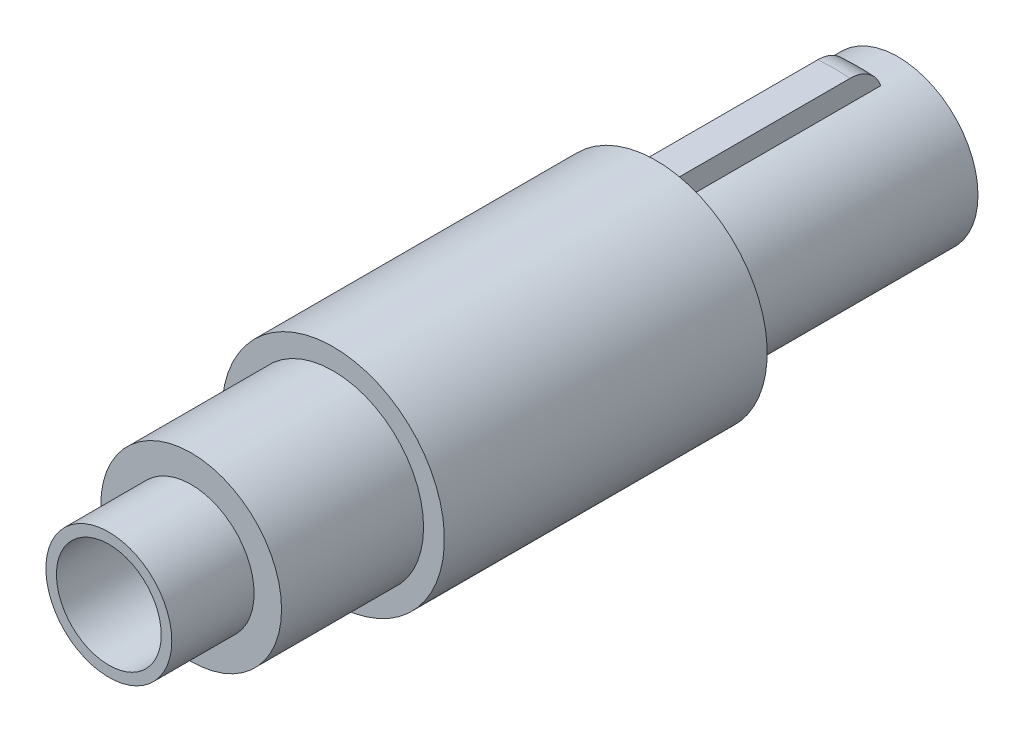
ISO-10303-21;
HEADER;
FILE_DESCRIPTION(('STEP AP214'),'2;1');
FILE_NAME('part.step','',(''),(''),'','','');
FILE_SCHEMA(('AUTOMOTIVE_DESIGN { 1 0 10303 214 1 1 1 1 }'));
ENDSEC;
DATA;
#1=APPLICATION_CONTEXT('core data for automotive mechanical design processes');
#2=APPLICATION_PROTOCOL_DEFINITION('international standard','automotive_design',2000,#1);
#3=PRODUCT_CONTEXT('',#1,'mechanical');
#4=PRODUCT('Part','Part','',(#3));
#5=PRODUCT_RELATED_PRODUCT_CATEGORY('part','',(#4));
#6=PRODUCT_DEFINITION_FORMATION('','',#4);
#7=PRODUCT_DEFINITION_CONTEXT('part definition',#1,'design');
#8=PRODUCT_DEFINITION('design','',#6,#7);
#9=PRODUCT_DEFINITION_SHAPE('','',#8);
#10=(LENGTH_UNIT() NAMED_UNIT(*) SI_UNIT(.MILLI.,.METRE.));
#11=(NAMED_UNIT(*) PLANE_ANGLE_UNIT() SI_UNIT($,.RADIAN.));
#12=(NAMED_UNIT(*) SI_UNIT($,.STERADIAN.) SOLID_ANGLE_UNIT());
#13=UNCERTAINTY_MEASURE_WITH_UNIT(LENGTH_MEASURE(1.E-05),#10,'distance_accuracy_value','');
#14=(GEOMETRIC_REPRESENTATION_CONTEXT(3) GLOBAL_UNCERTAINTY_ASSIGNED_CONTEXT((#13)) GLOBAL_UNIT_ASSIGNED_CONTEXT((#10,
#11,#12)) REPRESENTATION_CONTEXT('',''));
#15=CARTESIAN_POINT('',(0.,0.,0.));
#16=DIRECTION('',(0.,0.,1.));
#17=DIRECTION('',(1.,0.,0.));
#18=AXIS2_PLACEMENT_3D('',#15,#16,#17);
#19=CARTESIAN_POINT('',(0.,0.,28.8));
#20=DIRECTION('',(0.,0.,1.));
#21=DIRECTION('',(1.,0.,0.));
#22=AXIS2_PLACEMENT_3D('',#19,#20,#21);
#23=PLANE('',#22);
#24=CARTESIAN_POINT('',(0.,0.,28.8));
#25=DIRECTION('',(0.,0.,1.));
#26=DIRECTION('',(1.,0.,0.));
#27=AXIS2_PLACEMENT_3D('',#24,#25,#26);
#28=CIRCLE('',#27,5.6);
#29=CARTESIAN_POINT('',(5.6,0.,28.8));
#30=VERTEX_POINT('',#29);
#31=EDGE_CURVE('E185',#30,#30,#28,.T.);
#32=ORIENTED_EDGE('',*,*,#31,.T.);
#33=EDGE_LOOP('',(#32));
#34=FACE_BOUND('',#33,.T.);
#35=CARTESIAN_POINT('',(0.,0.,28.8));
#36=DIRECTION('',(0.,0.,1.));
#37=DIRECTION('',(1.,0.,0.));
#38=AXIS2_PLACEMENT_3D('',#35,#36,#37);
#39=CIRCLE('',#38,3.9);
#40=CARTESIAN_POINT('',(3.9,0.,28.8));
#41=VERTEX_POINT('',#40);
#42=EDGE_CURVE('E100',#41,#41,#39,.F.);
#43=ORIENTED_EDGE('',*,*,#42,.T.);
#44=EDGE_LOOP('',(#43));
#45=FACE_BOUND('',#44,.T.);
#46=ADVANCED_FACE('F32',(#34,#45),#23,.T.);
#47=CARTESIAN_POINT('',(0.,0.,20.));
#48=DIRECTION('',(0.,0.,1.));
#49=DIRECTION('',(1.,0.,0.));
#50=AXIS2_PLACEMENT_3D('',#47,#48,#49);
#51=PLANE('',#50);
#52=CARTESIAN_POINT('',(0.,0.,20.));
#53=DIRECTION('',(0.,0.,1.));
#54=DIRECTION('',(1.,0.,0.));
#55=AXIS2_PLACEMENT_3D('',#52,#53,#54);
#56=CIRCLE('',#55,6.89);
#57=CARTESIAN_POINT('',(-6.89,0.,20.));
#58=VERTEX_POINT('',#57);
#59=EDGE_CURVE('E94',#58,#58,#56,.T.);
#60=ORIENTED_EDGE('',*,*,#59,.T.);
#61=EDGE_LOOP('',(#60));
#62=FACE_BOUND('',#61,.T.);
#63=CARTESIAN_POINT('',(0.,0.,20.));
#64=DIRECTION('',(0.,0.,1.));
#65=DIRECTION('',(1.,0.,0.));
#66=AXIS2_PLACEMENT_3D('',#63,#64,#65);
#67=CIRCLE('',#66,5.6);
#68=CARTESIAN_POINT('',(5.6,0.,20.));
#69=VERTEX_POINT('',#68);
#70=EDGE_CURVE('E183',#69,#69,#67,.F.);
#71=ORIENTED_EDGE('',*,*,#70,.T.);
#72=EDGE_LOOP('',(#71));
#73=FACE_BOUND('',#72,.T.);
#74=ADVANCED_FACE('F147',(#62,#73),#51,.T.);
#75=CARTESIAN_POINT('',(0.,0.,20.));
#76=DIRECTION('',(0.,0.,-1.));
#77=DIRECTION('',(-1.,0.,0.));
#78=AXIS2_PLACEMENT_3D('',#75,#76,#77);
#79=CYLINDRICAL_SURFACE('',#78,6.89);
#80=CARTESIAN_POINT('',(0.,0.,0.));
#81=DIRECTION('',(0.,0.,1.));
#82=DIRECTION('',(1.,0.,0.));
#83=AXIS2_PLACEMENT_3D('',#80,#81,#82);
#84=CIRCLE('',#83,6.89);
#85=CARTESIAN_POINT('',(-6.89,0.,0.));
#86=VERTEX_POINT('',#85);
#87=EDGE_CURVE('E97',#86,#86,#84,.T.);
#88=CARTESIAN_POINT('',(-6.89,0.,20.));
#89=CARTESIAN_POINT('',(-6.89,0.,19.7916666666667));
#90=CARTESIAN_POINT('',(-6.89,0.,19.5833333333333));
#91=CARTESIAN_POINT('',(-6.89,0.,19.1666666666667));
#92=CARTESIAN_POINT('',(-6.89,0.,18.9583333333333));
#93=CARTESIAN_POINT('',(-6.89,0.,18.5416666666667));
#94=CARTESIAN_POINT('',(-6.89,0.,18.3333333333333));
#95=CARTESIAN_POINT('',(-6.89,0.,17.9166666666667));
#96=CARTESIAN_POINT('',(-6.89,0.,17.7083333333333));
#97=CARTESIAN_POINT('',(-6.89,0.,17.2916666666667));
#98=CARTESIAN_POINT('',(-6.89,0.,17.0833333333333));
#99=CARTESIAN_POINT('',(-6.89,0.,16.6666666666667));
#100=CARTESIAN_POINT('',(-6.89,0.,16.4583333333333));
#101=CARTESIAN_POINT('',(-6.89,0.,16.0416666666667));
#102=CARTESIAN_POINT('',(-6.89,0.,15.8333333333333));
#103=CARTESIAN_POINT('',(-6.89,0.,15.4166666666667));
#104=CARTESIAN_POINT('',(-6.89,0.,15.2083333333333));
#105=CARTESIAN_POINT('',(-6.89,0.,14.7916666666667));
#106=CARTESIAN_POINT('',(-6.89,0.,14.5833333333333));
#107=CARTESIAN_POINT('',(-6.89,0.,14.1666666666667));
#108=CARTESIAN_POINT('',(-6.89,0.,13.9583333333333));
#109=CARTESIAN_POINT('',(-6.89,0.,13.5416666666667));
#110=CARTESIAN_POINT('',(-6.89,0.,13.3333333333333));
#111=CARTESIAN_POINT('',(-6.89,0.,12.9166666666667));
#112=CARTESIAN_POINT('',(-6.89,0.,12.7083333333333));
#113=CARTESIAN_POINT('',(-6.89,0.,12.2916666666667));
#114=CARTESIAN_POINT('',(-6.89,0.,12.0833333333333));
#115=CARTESIAN_POINT('',(-6.89,0.,11.6666666666667));
#116=CARTESIAN_POINT('',(-6.89,0.,11.4583333333333));
#117=CARTESIAN_POINT('',(-6.89,0.,11.0416666666667));
#118=CARTESIAN_POINT('',(-6.89,0.,10.8333333333333));
#119=CARTESIAN_POINT('',(-6.89,0.,10.4166666666667));
#120=CARTESIAN_POINT('',(-6.89,0.,10.2083333333333));
#121=CARTESIAN_POINT('',(-6.89,0.,9.79166666666667));
#122=CARTESIAN_POINT('',(-6.89,0.,9.58333333333333));
#123=CARTESIAN_POINT('',(-6.89,0.,9.16666666666667));
#124=CARTESIAN_POINT('',(-6.89,0.,8.95833333333333));
#125=CARTESIAN_POINT('',(-6.89,0.,8.54166666666667));
#126=CARTESIAN_POINT('',(-6.89,0.,8.33333333333333));
#127=CARTESIAN_POINT('',(-6.89,0.,7.91666666666667));
#128=CARTESIAN_POINT('',(-6.89,0.,7.70833333333333));
#129=CARTESIAN_POINT('',(-6.89,0.,7.29166666666667));
#130=CARTESIAN_POINT('',(-6.89,0.,7.08333333333333));
#131=CARTESIAN_POINT('',(-6.89,0.,6.66666666666667));
#132=CARTESIAN_POINT('',(-6.89,0.,6.45833333333333));
#133=CARTESIAN_POINT('',(-6.89,0.,6.04166666666667));
#134=CARTESIAN_POINT('',(-6.89,0.,5.83333333333333));
#135=CARTESIAN_POINT('',(-6.89,0.,5.41666666666667));
#136=CARTESIAN_POINT('',(-6.89,0.,5.20833333333333));
#137=CARTESIAN_POINT('',(-6.89,0.,4.79166666666667));
#138=CARTESIAN_POINT('',(-6.89,0.,4.58333333333334));
#139=CARTESIAN_POINT('',(-6.89,0.,4.16666666666667));
#140=CARTESIAN_POINT('',(-6.89,0.,3.95833333333334));
#141=CARTESIAN_POINT('',(-6.89,0.,3.54166666666667));
#142=CARTESIAN_POINT('',(-6.89,0.,3.33333333333334));
#143=CARTESIAN_POINT('',(-6.89,0.,2.91666666666667));
#144=CARTESIAN_POINT('',(-6.89,0.,2.70833333333334));
#145=CARTESIAN_POINT('',(-6.89,0.,2.29166666666667));
#146=CARTESIAN_POINT('',(-6.89,0.,2.08333333333334));
#147=CARTESIAN_POINT('',(-6.89,0.,1.66666666666667));
#148=CARTESIAN_POINT('',(-6.89,0.,1.45833333333333));
#149=CARTESIAN_POINT('',(-6.89,0.,1.04166666666667));
#150=CARTESIAN_POINT('',(-6.89,0.,0.833333333333334));
#151=CARTESIAN_POINT('',(-6.89,0.,0.416666666666667));
#152=CARTESIAN_POINT('',(-6.89,0.,0.208333333333334));
#153=CARTESIAN_POINT('',(-6.89,0.,0.));
#154=B_SPLINE_CURVE_WITH_KNOTS('',3,(#88,#89,#90,#91,#92,#93,#94,#95,#96,#97,#98,#99,#100,#101,
#102,#103,#104,#105,#106,#107,#108,#109,#110,#111,#112,#113,#114,#115,#116,#117,#118,#119,#120,
#121,#122,#123,#124,#125,#126,#127,#128,#129,#130,#131,#132,#133,#134,#135,#136,#137,#138,#139,
#140,#141,#142,#143,#144,#145,#146,#147,#148,#149,#150,#151,#152,#153),.UNSPECIFIED.,.F.,.F.,(4,
2,2,2,2,2,2,2,2,2,2,2,2,2,2,2,2,2,2,2,2,2,2,2,2,2,2,2,2,2,2,2,4),(0.,0.625000000000001,1.25,
1.875,2.5,3.125,3.75,4.375,5.,5.62500000000001,6.25000000000001,6.875,7.50000000000001,8.125,
8.75,9.37500000000001,10.,10.625,11.25,11.875,12.5,13.125,13.75,14.375,15.,15.625,16.25,16.875,
17.5,18.125,18.75,19.375,20.),.UNSPECIFIED.);
#155=EDGE_CURVE('BSEAM150',#58,#86,#154,.T.);
#156=ORIENTED_EDGE('',*,*,#59,.F.);
#157=ORIENTED_EDGE('',*,*,#87,.T.);
#158=ORIENTED_EDGE('',*,*,#155,.T.);
#159=ORIENTED_EDGE('',*,*,#155,.F.);
#160=EDGE_LOOP('',(#156,#158,#157,#159));
#161=FACE_BOUND('',#160,.T.);
#162=ADVANCED_FACE('F150',(#161),#79,.T.);
#163=CARTESIAN_POINT('',(0.,0.,0.));
#164=DIRECTION('',(0.,0.,1.));
#165=DIRECTION('',(1.,0.,0.));
#166=AXIS2_PLACEMENT_3D('',#163,#164,#165);
#167=PLANE('',#166);
#168=CARTESIAN_POINT('',(0.,0.,0.));
#169=DIRECTION('',(0.,0.,1.));
#170=DIRECTION('',(1.,0.,0.));
#171=AXIS2_PLACEMENT_3D('',#168,#169,#170);
#172=CIRCLE('',#171,4.95);
#173=CARTESIAN_POINT('',(-1.07177579889317,4.83257660434958,0.));
#174=VERTEX_POINT('',#173);
#175=CARTESIAN_POINT('',(0.928224201106829,4.86219084698242,0.));
#176=VERTEX_POINT('',#175);
#177=EDGE_CURVE('E90',#174,#176,#172,.T.);
#178=ORIENTED_EDGE('',*,*,#177,.T.);
#179=DIRECTION('',(0.,1.,0.));
#180=VECTOR('',#179,1.);
#181=CARTESIAN_POINT('',(0.928224201106829,4.20642129929581,0.));
#182=LINE('',#181,#180);
#183=CARTESIAN_POINT('',(0.928224201106829,6.20642129929581,0.));
#184=VERTEX_POINT('',#183);
#185=EDGE_CURVE('E202',#176,#184,#182,.T.);
#186=ORIENTED_EDGE('',*,*,#185,.T.);
#187=DIRECTION('',(-1.,0.,0.));
#188=VECTOR('',#187,1.);
#189=CARTESIAN_POINT('',(-1.07177579889317,6.20642129929581,0.));
#190=LINE('',#189,#188);
#191=CARTESIAN_POINT('',(-1.07177579889317,6.20642129929581,0.));
#192=VERTEX_POINT('',#191);
#193=EDGE_CURVE('E206',#184,#192,#190,.T.);
#194=ORIENTED_EDGE('',*,*,#193,.T.);
#195=DIRECTION('',(0.,-1.,0.));
#196=VECTOR('',#195,1.);
#197=CARTESIAN_POINT('',(-1.07177579889317,4.20642129929581,0.));
#198=LINE('',#197,#196);
#199=EDGE_CURVE('E204',#192,#174,#198,.T.);
#200=ORIENTED_EDGE('',*,*,#199,.T.);
#201=EDGE_LOOP('',(#178,#186,#194,#200));
#202=FACE_BOUND('',#201,.T.);
#203=ORIENTED_EDGE('',*,*,#87,.F.);
#204=EDGE_LOOP('',(#203));
#205=FACE_BOUND('',#204,.T.);
#206=ADVANCED_FACE('F145',(#202,#205),#167,.F.);
#207=CARTESIAN_POINT('',(0.,0.,-15.));
#208=DIRECTION('',(0.,0.,1.));
#209=DIRECTION('',(1.,0.,0.));
#210=AXIS2_PLACEMENT_3D('',#207,#208,#209);
#211=CYLINDRICAL_SURFACE('',#210,4.95);
#212=DIRECTION('',(0.,0.,1.));
#213=VECTOR('',#212,1.);
#214=CARTESIAN_POINT('',(0.928224201106829,4.86219084698242,-15.));
#215=LINE('',#214,#213);
#216=CARTESIAN_POINT('',(0.928224201106829,4.86219084698242,-13.));
#217=VERTEX_POINT('',#216);
#218=EDGE_CURVE('E91',#176,#217,#215,.F.);
#219=ORIENTED_EDGE('',*,*,#218,.F.);
#220=ORIENTED_EDGE('',*,*,#177,.F.);
#221=DIRECTION('',(0.,0.,1.));
#222=VECTOR('',#221,1.);
#223=CARTESIAN_POINT('',(-1.07177579889317,4.83257660434958,-15.));
#224=LINE('',#223,#222);
#225=CARTESIAN_POINT('',(-1.07177579889317,4.83257660434958,-13.));
#226=VERTEX_POINT('',#225);
#227=EDGE_CURVE('E80',#226,#174,#224,.T.);
#228=ORIENTED_EDGE('',*,*,#227,.F.);
#229=CARTESIAN_POINT('',(0.,0.,-13.));
#230=DIRECTION('',(0.,0.,-1.));
#231=DIRECTION('',(-1.,0.,0.));
#232=AXIS2_PLACEMENT_3D('',#229,#230,#231);
#233=CIRCLE('',#232,4.95);
#234=EDGE_CURVE('E88',#217,#226,#233,.F.);
#235=ORIENTED_EDGE('',*,*,#234,.F.);
#236=EDGE_LOOP('',(#219,#220,#228,#235));
#237=FACE_BOUND('',#236,.T.);
#238=CARTESIAN_POINT('',(0.,0.,-15.));
#239=DIRECTION('',(0.,0.,1.));
#240=DIRECTION('',(1.,0.,0.));
#241=AXIS2_PLACEMENT_3D('',#238,#239,#240);
#242=CIRCLE('',#241,4.95);
#243=CARTESIAN_POINT('',(4.95,0.,-15.));
#244=VERTEX_POINT('',#243);
#245=EDGE_CURVE('E193',#244,#244,#242,.T.);
#246=ORIENTED_EDGE('',*,*,#245,.T.);
#247=EDGE_LOOP('',(#246));
#248=FACE_BOUND('',#247,.T.);
#249=ADVANCED_FACE('F86',(#237,#248),#211,.T.);
#250=CARTESIAN_POINT('',(0.,0.,-15.));
#251=DIRECTION('',(0.,0.,1.));
#252=DIRECTION('',(1.,0.,0.));
#253=AXIS2_PLACEMENT_3D('',#250,#251,#252);
#254=PLANE('',#253);
#255=CARTESIAN_POINT('',(0.,0.,-15.));
#256=DIRECTION('',(0.,0.,1.));
#257=DIRECTION('',(1.,0.,0.));
#258=AXIS2_PLACEMENT_3D('',#255,#256,#257);
#259=CIRCLE('',#258,3.24503097154707);
#260=CARTESIAN_POINT('',(3.24503097154707,0.,-15.));
#261=VERTEX_POINT('',#260);
#262=EDGE_CURVE('E215',#261,#261,#259,.T.);
#263=ORIENTED_EDGE('',*,*,#262,.T.);
#264=EDGE_LOOP('',(#263));
#265=FACE_BOUND('',#264,.T.);
#266=ORIENTED_EDGE('',*,*,#245,.F.);
#267=EDGE_LOOP('',(#266));
#268=FACE_BOUND('',#267,.T.);
#269=ADVANCED_FACE('F144',(#265,#268),#254,.F.);
#270=CARTESIAN_POINT('',(0.,0.,28.8));
#271=DIRECTION('',(0.,0.,-1.));
#272=DIRECTION('',(-1.,0.,0.));
#273=AXIS2_PLACEMENT_3D('',#270,#271,#272);
#274=CYLINDRICAL_SURFACE('',#273,5.6);
#275=ORIENTED_EDGE('',*,*,#70,.F.);
#276=EDGE_LOOP('',(#275));
#277=FACE_BOUND('',#276,.T.);
#278=ORIENTED_EDGE('',*,*,#31,.F.);
#279=EDGE_LOOP('',(#278));
#280=FACE_BOUND('',#279,.T.);
#281=ADVANCED_FACE('F170',(#277,#280),#274,.T.);
#282=CARTESIAN_POINT('',(0.,0.,33.9));
#283=DIRECTION('',(0.,0.,-1.));
#284=DIRECTION('',(-1.,0.,0.));
#285=AXIS2_PLACEMENT_3D('',#282,#283,#284);
#286=CYLINDRICAL_SURFACE('',#285,3.9);
#287=ORIENTED_EDGE('',*,*,#42,.F.);
#288=EDGE_LOOP('',(#287));
#289=FACE_BOUND('',#288,.T.);
#290=CARTESIAN_POINT('',(0.,0.,33.9));
#291=DIRECTION('',(0.,0.,1.));
#292=DIRECTION('',(1.,0.,0.));
#293=AXIS2_PLACEMENT_3D('',#290,#291,#292);
#294=CIRCLE('',#293,3.9);
#295=CARTESIAN_POINT('',(3.9,0.,33.9));
#296=VERTEX_POINT('',#295);
#297=EDGE_CURVE('E189',#296,#296,#294,.T.);
#298=ORIENTED_EDGE('',*,*,#297,.F.);
#299=EDGE_LOOP('',(#298));
#300=FACE_BOUND('',#299,.T.);
#301=ADVANCED_FACE('F168',(#289,#300),#286,.T.);
#302=CARTESIAN_POINT('',(0.,0.,33.9));
#303=DIRECTION('',(0.,0.,1.));
#304=DIRECTION('',(1.,0.,0.));
#305=AXIS2_PLACEMENT_3D('',#302,#303,#304);
#306=PLANE('',#305);
#307=CARTESIAN_POINT('',(0.,0.,33.9));
#308=DIRECTION('',(0.,0.,1.));
#309=DIRECTION('',(1.,0.,0.));
#310=AXIS2_PLACEMENT_3D('',#307,#308,#309);
#311=CIRCLE('',#310,3.24503097154707);
#312=CARTESIAN_POINT('',(3.24503097154707,0.,33.9));
#313=VERTEX_POINT('',#312);
#314=EDGE_CURVE('E212',#313,#313,#311,.T.);
#315=ORIENTED_EDGE('',*,*,#314,.F.);
#316=EDGE_LOOP('',(#315));
#317=FACE_BOUND('',#316,.T.);
#318=ORIENTED_EDGE('',*,*,#297,.T.);
#319=EDGE_LOOP('',(#318));
#320=FACE_BOUND('',#319,.T.);
#321=ADVANCED_FACE('F177',(#317,#320),#306,.T.);
#322=CARTESIAN_POINT('',(0.,0.,-15.));
#323=DIRECTION('',(0.,0.,1.));
#324=DIRECTION('',(1.,0.,0.));
#325=AXIS2_PLACEMENT_3D('',#322,#323,#324);
#326=CYLINDRICAL_SURFACE('',#325,3.24503097154707);
#327=ORIENTED_EDGE('',*,*,#262,.F.);
#328=EDGE_LOOP('',(#327));
#329=FACE_BOUND('',#328,.T.);
#330=ORIENTED_EDGE('',*,*,#314,.T.);
#331=EDGE_LOOP('',(#330));
#332=FACE_BOUND('',#331,.T.);
#333=ADVANCED_FACE('F223',(#329,#332),#326,.F.);
#334=CARTESIAN_POINT('',(0.928224201106829,4.20642129929581,-13.));
#335=DIRECTION('',(1.,0.,0.));
#336=DIRECTION('',(0.,0.,-1.));
#337=AXIS2_PLACEMENT_3D('',#334,#335,#336);
#338=PLANE('',#337);
#339=ORIENTED_EDGE('',*,*,#218,.T.);
#340=CARTESIAN_POINT('',(-2.79569389210319,6.20642129929581,-11.002538298574));
#341=CARTESIAN_POINT('',(-2.73749576426425,6.20642129929581,-13.0874541746228));
#342=CARTESIAN_POINT('',(-2.73993695112134,4.12252901795486,-13.));
#343=CARTESIAN_POINT('',(-2.68219204996834,6.20642129929581,-10.9993718852485));
#344=CARTESIAN_POINT('',(-2.66453672843028,6.20642129929581,-13.0324311348312));
#345=CARTESIAN_POINT('',(-2.66283623852598,4.17376819789622,-13.));
#346=CARTESIAN_POINT('',(-2.56867576728029,6.20642129929581,-10.9993049264978));
#347=CARTESIAN_POINT('',(-2.58290670899761,6.20642129929581,-12.9810581148752));
#348=CARTESIAN_POINT('',(-2.58130154564579,4.22484251734563,-13.));
#349=CARTESIAN_POINT('',(-2.34184210335966,6.20642129929581,-11.0038523131523));
#350=CARTESIAN_POINT('',(-2.40718589089541,6.20642129929581,-12.8875037429906));
#351=CARTESIAN_POINT('',(-2.40931628231855,4.32522962741146,-13.));
#352=CARTESIAN_POINT('',(-2.22852463725456,6.20642129929581,-11.0084618975055));
#353=CARTESIAN_POINT('',(-2.31326065356108,6.20642129929581,-12.8450201810325));
#354=CARTESIAN_POINT('',(-2.31887486410541,4.37454415676033,-13.));
#355=CARTESIAN_POINT('',(-2.00186264992001,6.20642129929581,-11.02085665137));
#356=CARTESIAN_POINT('',(-2.11527251224636,6.2064212992958,-12.7688605525765));
#357=CARTESIAN_POINT('',(-2.12868532340892,4.4701835600191,-13.));
#358=CARTESIAN_POINT('',(-1.88851851281804,6.20642129929581,-11.0286480411941));
#359=CARTESIAN_POINT('',(-2.01119307019918,6.20642129929581,-12.7349334953202));
#360=CARTESIAN_POINT('',(-2.02891926789085,4.51650237077073,-13.));
#361=CARTESIAN_POINT('',(-1.66193116772518,6.20642129929581,-11.0458988273204));
#362=CARTESIAN_POINT('',(-1.79518738267405,6.2064212992958,-12.6751892992452));
#363=CARTESIAN_POINT('',(-1.8203953504087,4.60450508280435,-13.));
#364=CARTESIAN_POINT('',(-1.54868799591367,6.20642129929581,-11.0553586802283));
#365=CARTESIAN_POINT('',(-1.6831367539056,6.2064212992958,-12.649151731621));
#366=CARTESIAN_POINT('',(-1.71163503133755,4.64618771020457,-13.));
#367=CARTESIAN_POINT('',(-1.32238129855997,6.20642129929581,-11.0744466888044));
#368=CARTESIAN_POINT('',(-1.45316828698806,6.2064212992958,-12.6042876460009));
#369=CARTESIAN_POINT('',(-1.48588457382873,4.72322360706707,-13.));
#370=CARTESIAN_POINT('',(-1.20931774901402,6.20642129929581,-11.0840745826798));
#371=CARTESIAN_POINT('',(-1.33502672299593,6.20642129929581,-12.5852778552906));
#372=CARTESIAN_POINT('',(-1.36890650402605,4.75858589868031,-13.));
#373=CARTESIAN_POINT('',(-0.983098941761354,6.20642129929581,-11.1021157179838));
#374=CARTESIAN_POINT('',(-1.09431981362196,6.20642129929581,-12.5534336611145));
#375=CARTESIAN_POINT('',(-1.12768419066618,4.82144723825594,-13.));
#376=CARTESIAN_POINT('',(-0.869943693066409,6.20642129929581,-11.110529066943));
#377=CARTESIAN_POINT('',(-0.971420074715867,6.20642129929581,-12.5404731103006));
#378=CARTESIAN_POINT('',(-1.00344059173782,4.848946982546,-13.));
#379=CARTESIAN_POINT('',(-0.643718368718521,6.20642129929581,-11.1249119297398));
#380=CARTESIAN_POINT('',(-0.722962398308052,6.20642129929581,-12.5198682905382));
#381=CARTESIAN_POINT('',(-0.749645341119476,4.89459908018541,-13.));
#382=CARTESIAN_POINT('',(-0.53064864771666,6.20642129929581,-11.1308867462795));
#383=CARTESIAN_POINT('',(-0.596996716425942,6.20642129929581,-12.512131253268));
#384=CARTESIAN_POINT('',(-0.6201058882019,4.9127717381375,-13.));
#385=CARTESIAN_POINT('',(-0.304382896324356,6.20642129929581,-11.1395541426572));
#386=CARTESIAN_POINT('',(-0.343669599519397,6.20642129929581,-12.5012898184409));
#387=CARTESIAN_POINT('',(-0.35773111575778,4.93881873203329,-13.));
#388=CARTESIAN_POINT('',(-0.191186870923202,6.20642129929581,-11.1422468478503));
#389=CARTESIAN_POINT('',(-0.215833283174064,6.20642129929581,-12.4981425344921));
#390=CARTESIAN_POINT('',(-0.224895922304577,4.94669346129096,-13.));
#391=CARTESIAN_POINT('',(0.087893066560653,6.20642129929581,-11.1442920272345));
#392=CARTESIAN_POINT('',(0.0990470701558867,6.20642129929581,-12.4956894291285));
#393=CARTESIAN_POINT('',(0.103340852340178,4.95274848038895,-13.));
#394=CARTESIAN_POINT('',(0.253797341117133,6.20642129929581,-11.1415086532852));
#395=CARTESIAN_POINT('',(0.287406962202704,6.20642129929581,-12.498834750808));
#396=CARTESIAN_POINT('',(0.29910923073621,4.94471694713822,-13.));
#397=CARTESIAN_POINT('',(0.585310981385244,6.20642129929581,-11.1287757836998));
#398=CARTESIAN_POINT('',(0.658524454903799,6.20642129929581,-12.5148125061966));
#399=CARTESIAN_POINT('',(0.683454841321221,4.90640318515982,-13.));
#400=CARTESIAN_POINT('',(0.750920322367196,6.20642129929581,-11.118825713116));
#401=CARTESIAN_POINT('',(0.842783434764993,6.20642129929581,-12.5277809899327));
#402=CARTESIAN_POINT('',(0.872031495276537,4.87611917122468,-13.));
#403=CARTESIAN_POINT('',(1.08196554078039,6.20642129929581,-11.0948313252717));
#404=CARTESIAN_POINT('',(1.20158826676713,6.20642129929581,-12.5653724771125));
#405=CARTESIAN_POINT('',(1.23542114858655,4.79696945210439,-13.));
#406=CARTESIAN_POINT('',(1.24740111043824,6.20642129929581,-11.0807831818013));
#407=CARTESIAN_POINT('',(1.37731988802229,6.20642129929581,-12.5903259359946));
#408=CARTESIAN_POINT('',(1.41022109055482,4.74808636865991,-13.));
#409=CARTESIAN_POINT('',(1.57838888849476,6.20642129929581,-11.0528435983009));
#410=CARTESIAN_POINT('',(1.71489011807471,6.20642129929581,-12.6546017953058));
#411=CARTESIAN_POINT('',(1.74202010950196,4.63665526341544,-13.));
#412=CARTESIAN_POINT('',(1.74394110721995,6.20642129929581,-11.0389522575617));
#413=CARTESIAN_POINT('',(1.87747624942997,6.20642129929581,-12.6944679568614));
#414=CARTESIAN_POINT('',(1.89900842110738,4.57409904368608,-13.));
#415=CARTESIAN_POINT('',(2.0773793924749,6.20642129929581,-11.0158660816462));
#416=CARTESIAN_POINT('',(2.18563506117355,6.20642129929581,-12.7917120211748));
#417=CARTESIAN_POINT('',(2.19524436523489,4.43961820321695,-13.));
#418=CARTESIAN_POINT('',(2.24526989191148,6.20642129929581,-11.0067287745169));
#419=CARTESIAN_POINT('',(2.3311615018268,6.2064212992958,-12.8500543498943));
#420=CARTESIAN_POINT('',(2.33426005139474,4.367591470811,-13.));
#421=CARTESIAN_POINT('',(2.58110235226112,6.20642129929581,-10.9983266426949));
#422=CARTESIAN_POINT('',(2.59576301223671,6.2064212992958,-12.985458350257));
#423=CARTESIAN_POINT('',(2.59215415279579,4.21963410574088,-13.));
#424=CARTESIAN_POINT('',(2.74904357903973,6.20642129929581,-10.9990426658436));
#425=CARTESIAN_POINT('',(2.71446530169848,6.20642129929581,-13.063448448516));
#426=CARTESIAN_POINT('',(2.71107117874217,4.14371133215393,-13.));
#427=CARTESIAN_POINT('',(3.00126857572584,6.20642129929581,-11.0112061693654));
#428=CARTESIAN_POINT('',(2.86486841553626,6.20642129929581,-13.1926257696963));
#429=CARTESIAN_POINT('',(2.87580450386886,4.02948733269968,-13.));
#430=CARTESIAN_POINT('',(3.08581215526349,6.20642129929581,-11.017166019555));
#431=CARTESIAN_POINT('',(2.91108342823634,6.2064212992958,-13.2388088368531));
#432=CARTESIAN_POINT('',(2.92866756879164,3.99116679663155,-13.));
#433=CARTESIAN_POINT('',(3.25445683204315,6.20642129929581,-11.0334725821923));
#434=CARTESIAN_POINT('',(2.99283238489821,6.2064212992958,-13.3350714614529));
#435=CARTESIAN_POINT('',(3.02974313689532,3.91499168033073,-13.));
#436=CARTESIAN_POINT('',(3.3385580731396,6.20642129929581,-11.0438177660404));
#437=CARTESIAN_POINT('',(3.02815171590238,6.2064212992958,-13.3852595934683));
#438=CARTESIAN_POINT('',(3.07795725338293,3.87713694246114,-13.));
#439=CARTESIAN_POINT('',(3.50660661575136,6.20642129929581,-11.0696168094699));
#440=CARTESIAN_POINT('',(3.08665334381076,6.20642129929581,-13.4889058270957));
#441=CARTESIAN_POINT('',(3.17025805751185,3.8020430689267,-13.));
#442=CARTESIAN_POINT('',(3.59054855914521,6.20642129929581,-11.0851065132757));
#443=CARTESIAN_POINT('',(3.10945550588428,6.20642129929581,-13.5424587630366));
#444=CARTESIAN_POINT('',(3.21431291862642,3.76481023418497,-13.));
#445=CARTESIAN_POINT('',(3.75727644376679,6.20642129929581,-11.1218237238372));
#446=CARTESIAN_POINT('',(3.14086697398681,6.20642129929581,-13.6508270374638));
#447=CARTESIAN_POINT('',(3.29814732870526,3.69158712010429,-13.));
#448=CARTESIAN_POINT('',(3.84006070182589,6.20642129929581,-11.1430588229089));
#449=CARTESIAN_POINT('',(3.1491058312317,6.20642129929581,-13.7056724685009));
#450=CARTESIAN_POINT('',(3.33792112249085,3.65559855650237,-13.));
#451=CARTESIAN_POINT('',(3.92195598432226,6.20642129929581,-11.1674717702453));
#452=CARTESIAN_POINT('',(3.14921961866051,6.20642129929581,-13.759385185647));
#453=CARTESIAN_POINT('',(3.37561782510031,3.62045636610429,-13.));
#454=(BOUNDED_SURFACE() B_SPLINE_SURFACE(3,2,((#340,#341,#342),(#343,#344,#345),(#346,#347,
#348),(#349,#350,#351),(#352,#353,#354),(#355,#356,#357),(#358,#359,#360),(#361,#362,#363),
(#364,#365,#366),(#367,#368,#369),(#370,#371,#372),(#373,#374,#375),(#376,#377,#378),(#379,#380,
#381),(#382,#383,#384),(#385,#386,#387),(#388,#389,#390),(#391,#392,#393),(#394,#395,#396),
(#397,#398,#399),(#400,#401,#402),(#403,#404,#405),(#406,#407,#408),(#409,#410,#411),(#412,#413,
#414),(#415,#416,#417),(#418,#419,#420),(#421,#422,#423),(#424,#425,#426),(#427,#428,#429),
(#430,#431,#432),(#433,#434,#435),(#436,#437,#438),(#439,#440,#441),(#442,#443,#444),(#445,#446,
#447),(#448,#449,#450),(#451,#452,#453)),.UNSPECIFIED.,.F.,.F.,
.F.) B_SPLINE_SURFACE_WITH_KNOTS((4,2,2,2,2,2,2,2,2,2,2,2,2,2,2,2,2,2,4),(3,3),(0.,
0.340494010600122,0.680641721695686,1.02145761691397,1.36236692780225,1.70278564175335,
2.04317419799058,2.38281856832791,2.7224499660784,3.22003382047922,3.71765759795274,
4.21574748244163,4.71413682723829,5.2184245288219,5.72173217278141,5.97589746109839,
6.22997422755473,6.48585975920595,6.74208509925147),(0.,1.),
.UNSPECIFIED.) GEOMETRIC_REPRESENTATION_ITEM() RATIONAL_B_SPLINE_SURFACE(((1.,0.692117713734278,
1.),(1.,0.701375452121498,1.),(1.,0.710410306477684,1.),(1.,0.727857671280425,1.),(1.,
0.73627080533641,1.),(1.,0.752333427117106,1.),(1.,0.759981382274576,1.),(1.,0.774320552636225,
1.),(1.,0.78101150502893,1.),(1.,0.793245259010675,1.),(1.,0.798789699027797,1.),(1.,
0.808566910176676,1.),(1.,0.812799797465741,1.),(1.,0.81979069970455,1.),(1.,0.822551918910915,
1.),(1.,0.826500516823354,1.),(1.,0.827687955637636,1.),(1.,0.828603223496475,1.),(1.,
0.82739539993689,1.),(1.,0.821585729950634,1.),(1.,0.816983611216187,1.),(1.,0.804781788383789,
1.),(1.,0.797179280588731,1.),(1.,0.779510135914779,1.),(1.,0.769442020306612,1.),(1.,
0.747277247133001,1.),(1.,0.735157992277853,1.),(1.,0.709553567723837,1.),(1.,0.696071098385705,
1.),(1.,0.675141686413571,1.),(1.,0.66801077379693,1.),(1.,0.65360109784148,1.),(1.,
0.646322386861799,1.),(1.,0.631632505556972,1.),(1.,0.62422076114082,1.),(1.,0.609382651491518,
1.),(1.,0.601956279913006,1.),(1.,0.594566032247154,1.))) REPRESENTATION_ITEM('') SURFACE());
#455=CARTESIAN_POINT('',(0.928224201106829,4.86219084698242,-13.));
#456=CARTESIAN_POINT('',(0.928224201106829,4.91532514037574,-12.9815135631995));
#457=CARTESIAN_POINT('',(0.928224201106829,4.96765304361573,-12.9607916289555));
#458=CARTESIAN_POINT('',(0.928224201106829,5.07037487352375,-12.9150148742599));
#459=CARTESIAN_POINT('',(0.928224201106829,5.12076889450188,-12.8899602654298));
#460=CARTESIAN_POINT('',(0.928224201106829,5.2684177536525,-12.8085887777535));
#461=CARTESIAN_POINT('',(0.928224201106829,5.36231215767165,-12.7460039335644));
#462=CARTESIAN_POINT('',(0.928224201106829,5.5382467005076,-12.6059710357564));
#463=CARTESIAN_POINT('',(0.928224201106829,5.62028255779542,-12.528517637225));
#464=CARTESIAN_POINT('',(0.928224201106829,5.7702181201616,-12.3609603234711));
#465=CARTESIAN_POINT('',(0.928224201106829,5.83811964654033,-12.2708580406478));
#466=CARTESIAN_POINT('',(0.928224201106829,5.95797812836284,-12.0804007430322));
#467=CARTESIAN_POINT('',(0.928224201106829,6.00990675779198,-11.9800279298495));
#468=CARTESIAN_POINT('',(0.928224201106829,6.09621005592063,-11.7719971283908));
#469=CARTESIAN_POINT('',(0.928224201106829,6.13059004255256,-11.664341358352));
#470=CARTESIAN_POINT('',(0.928224201106829,6.1725684390651,-11.4810482110248));
#471=CARTESIAN_POINT('',(0.928224201106829,6.18525736195653,-11.4065360806139));
#472=CARTESIAN_POINT('',(0.928224201106829,6.20218195304652,-11.2566827945455));
#473=CARTESIAN_POINT('',(0.928224201106829,6.20643154876623,-11.1813432114534));
#474=CARTESIAN_POINT('',(0.928224201106829,6.20642129929581,-11.1059708339999));
#475=B_SPLINE_CURVE_WITH_KNOTS('',3,(#455,#456,#457,#458,#459,#460,#461,#462,#463,#464,#465,
#466,#467,#468,#469,#470,#471,#472,#473,#474),.UNSPECIFIED.,.F.,.F.,(4,2,2,2,2,2,2,2,2,4),(0.,
0.168671151069125,0.3373340660303,0.67411791374865,1.01102305520098,1.34788475732683,
1.68534044418433,2.02269380782694,2.24900119397411,2.47493479097812),.UNSPECIFIED.);
#476=CARTESIAN_POINT('',(0.928224201106829,6.20642129929581,-11.1059708339999));
#477=VERTEX_POINT('',#476);
#478=EDGE_CURVE('E11',#217,#477,#475,.T.);
#479=ORIENTED_EDGE('',*,*,#478,.T.);
#480=DIRECTION('',(0.,0.,1.));
#481=VECTOR('',#480,1.);
#482=CARTESIAN_POINT('',(0.928224201106829,6.20642129929581,-13.));
#483=LINE('',#482,#481);
#484=EDGE_CURVE('E205',#477,#184,#483,.T.);
#485=ORIENTED_EDGE('',*,*,#484,.T.);
#486=ORIENTED_EDGE('',*,*,#185,.F.);
#487=EDGE_LOOP('',(#339,#479,#485,#486));
#488=FACE_BOUND('',#487,.T.);
#489=ADVANCED_FACE('F123',(#488),#338,.T.);
#490=CARTESIAN_POINT('',(-1.07177579889317,4.20642129929581,-13.));
#491=DIRECTION('',(-1.,0.,0.));
#492=DIRECTION('',(0.,0.,1.));
#493=AXIS2_PLACEMENT_3D('',#490,#491,#492);
#494=PLANE('',#493);
#495=DIRECTION('',(0.,0.,1.));
#496=VECTOR('',#495,1.);
#497=CARTESIAN_POINT('',(-1.07177579889317,6.20642129929581,-13.));
#498=LINE('',#497,#496);
#499=CARTESIAN_POINT('',(-1.07177579889317,6.20642129929581,-11.0950341606347));
#500=VERTEX_POINT('',#499);
#501=EDGE_CURVE('E81',#500,#192,#498,.T.);
#502=ORIENTED_EDGE('',*,*,#501,.F.);
#503=CARTESIAN_POINT('',(-1.07177579889317,6.20642129929581,-11.0950341606347));
#504=CARTESIAN_POINT('',(-1.07177579889317,6.20642084026617,-11.1515862075199));
#505=CARTESIAN_POINT('',(-1.07177579889317,6.20403606421131,-11.2081112068591));
#506=CARTESIAN_POINT('',(-1.07177579889317,6.19452108260989,-11.3207581157775));
#507=CARTESIAN_POINT('',(-1.07177579889317,6.18739105837201,-11.3768800406747));
#508=CARTESIAN_POINT('',(-1.07177579889317,6.15894411651542,-11.5439687522775));
#509=CARTESIAN_POINT('',(-1.07177579889317,6.13057018117534,-11.6538181420382));
#510=CARTESIAN_POINT('',(-1.07177579889317,6.05577728428124,-11.8671840713224));
#511=CARTESIAN_POINT('',(-1.07177579889317,6.00935035233211,-11.9706977902523));
#512=CARTESIAN_POINT('',(-1.07177579889317,5.89975547422731,-12.1684406118673));
#513=CARTESIAN_POINT('',(-1.07177579889317,5.83659107280738,-12.2626716746849));
#514=CARTESIAN_POINT('',(-1.07177579889317,5.69539931129023,-12.4390266483879));
#515=CARTESIAN_POINT('',(-1.07177579889317,5.61739187102824,-12.5211665269418));
#516=CARTESIAN_POINT('',(-1.07177579889317,5.44864900371704,-12.6711369408174));
#517=CARTESIAN_POINT('',(-1.07177579889317,5.35791686681107,-12.7389711637447));
#518=CARTESIAN_POINT('',(-1.07177579889317,5.19484182256917,-12.840609343134));
#519=CARTESIAN_POINT('',(-1.07177579889317,5.12503109866541,-12.8785383905616));
#520=CARTESIAN_POINT('',(-1.07177579889317,4.98150948895305,-12.9458018703074));
#521=CARTESIAN_POINT('',(-1.07177579889317,4.90780441410232,-12.9751487035722));
#522=CARTESIAN_POINT('',(-1.07177579889317,4.83257660434958,-13.));
#523=B_SPLINE_CURVE_WITH_KNOTS('',3,(#503,#504,#505,#506,#507,#508,#509,#510,#511,#512,#513,
#514,#515,#516,#517,#518,#519,#520,#521,#522),.UNSPECIFIED.,.F.,.F.,(4,2,2,2,2,2,2,2,2,4),(0.,
0.169552098205719,0.339097718456746,0.677716045995141,1.01648404352501,1.35518035252385,
1.69342528580524,2.03158292195475,2.26939929581052,2.50687031736642),.UNSPECIFIED.);
#524=EDGE_CURVE('E44',#500,#226,#523,.T.);
#525=ORIENTED_EDGE('',*,*,#524,.T.);
#526=ORIENTED_EDGE('',*,*,#227,.T.);
#527=ORIENTED_EDGE('',*,*,#199,.F.);
#528=EDGE_LOOP('',(#502,#525,#526,#527));
#529=FACE_BOUND('',#528,.T.);
#530=ADVANCED_FACE('F78',(#529),#494,.T.);
#531=CARTESIAN_POINT('',(-1.07177579889317,6.20642129929581,-13.));
#532=DIRECTION('',(0.,1.,0.));
#533=DIRECTION('',(0.,0.,1.));
#534=AXIS2_PLACEMENT_3D('',#531,#532,#533);
#535=PLANE('',#534);
#536=ORIENTED_EDGE('',*,*,#484,.F.);
#537=CARTESIAN_POINT('',(3.92195598432226,6.20642129929581,-11.1674717702453));
#538=CARTESIAN_POINT('',(3.84006070182589,6.20642129929581,-11.1430588229089));
#539=CARTESIAN_POINT('',(3.75727644376679,6.20642129929581,-11.1218237238372));
#540=CARTESIAN_POINT('',(3.59054855914521,6.20642129929581,-11.0851065132757));
#541=CARTESIAN_POINT('',(3.50660661575136,6.20642129929581,-11.0696168094699));
#542=CARTESIAN_POINT('',(3.3385580731396,6.20642129929581,-11.0438177660404));
#543=CARTESIAN_POINT('',(3.25445683204315,6.20642129929581,-11.0334725821923));
#544=CARTESIAN_POINT('',(3.08581215526349,6.20642129929581,-11.017166019555));
#545=CARTESIAN_POINT('',(3.00126857572584,6.20642129929581,-11.0112061693654));
#546=CARTESIAN_POINT('',(2.74904357903973,6.20642129929581,-10.9990426658436));
#547=CARTESIAN_POINT('',(2.58110235226112,6.20642129929581,-10.9983266426949));
#548=CARTESIAN_POINT('',(2.24526989191148,6.20642129929581,-11.0067287745169));
#549=CARTESIAN_POINT('',(2.0773793924749,6.20642129929581,-11.0158660816462));
#550=CARTESIAN_POINT('',(1.74394110721995,6.20642129929581,-11.0389522575617));
#551=CARTESIAN_POINT('',(1.57838888849476,6.20642129929581,-11.0528435983009));
#552=CARTESIAN_POINT('',(1.24740111043824,6.20642129929581,-11.0807831818013));
#553=CARTESIAN_POINT('',(1.08196554078039,6.20642129929581,-11.0948313252717));
#554=CARTESIAN_POINT('',(0.750920322367196,6.20642129929581,-11.118825713116));
#555=CARTESIAN_POINT('',(0.585310981385244,6.20642129929581,-11.1287757836998));
#556=CARTESIAN_POINT('',(0.253797341117133,6.20642129929581,-11.1415086532852));
#557=CARTESIAN_POINT('',(0.0878930665606529,6.20642129929581,-11.1442920272345));
#558=CARTESIAN_POINT('',(-0.191186870923202,6.20642129929581,-11.1422468478503));
#559=CARTESIAN_POINT('',(-0.304382896324356,6.20642129929581,-11.1395541426572));
#560=CARTESIAN_POINT('',(-0.53064864771666,6.20642129929581,-11.1308867462795));
#561=CARTESIAN_POINT('',(-0.643718368718521,6.20642129929581,-11.1249119297398));
#562=CARTESIAN_POINT('',(-0.869943693066409,6.20642129929581,-11.110529066943));
#563=CARTESIAN_POINT('',(-0.983098941761354,6.20642129929581,-11.1021157179838));
#564=CARTESIAN_POINT('',(-1.20931774901402,6.20642129929581,-11.0840745826798));
#565=CARTESIAN_POINT('',(-1.32238129855997,6.20642129929581,-11.0744466888044));
#566=CARTESIAN_POINT('',(-1.54868799591367,6.20642129929581,-11.0553586802283));
#567=CARTESIAN_POINT('',(-1.66193116772518,6.20642129929581,-11.0458988273204));
#568=CARTESIAN_POINT('',(-1.88851851281804,6.20642129929581,-11.0286480411941));
#569=CARTESIAN_POINT('',(-2.00186264992001,6.20642129929581,-11.02085665137));
#570=CARTESIAN_POINT('',(-2.22852463725456,6.20642129929581,-11.0084618975055));
#571=CARTESIAN_POINT('',(-2.34184210335966,6.20642129929581,-11.0038523131523));
#572=CARTESIAN_POINT('',(-2.56867576728029,6.20642129929581,-10.9993049264978));
#573=CARTESIAN_POINT('',(-2.68219204996834,6.20642129929581,-10.9993718852485));
#574=CARTESIAN_POINT('',(-2.79569389210319,6.20642129929581,-11.002538298574));
#575=B_SPLINE_CURVE_WITH_KNOTS('',3,(#537,#538,#539,#540,#541,#542,#543,#544,#545,#546,#547,
#548,#549,#550,#551,#552,#553,#554,#555,#556,#557,#558,#559,#560,#561,#562,#563,#564,#565,#566,
#567,#568,#569,#570,#571,#572,#573,#574),.UNSPECIFIED.,.F.,.F.,(4,2,2,2,2,2,2,2,2,2,2,2,2,2,2,2,
2,2,4),(0.,0.256225340045514,0.51211087169674,0.766187638153081,1.02035292647005,
1.52366057042957,2.02794827201318,2.52633761680984,3.02442750129873,3.52205127877224,
4.01963513317306,4.35926653092355,4.69891090126089,5.03929945749811,5.37971817144922,
5.72062748233749,6.06144337755578,6.40159108865134,6.74208509925147),.UNSPECIFIED.);
#576=EDGE_CURVE('E82',#477,#500,#575,.T.);
#577=ORIENTED_EDGE('',*,*,#576,.T.);
#578=ORIENTED_EDGE('',*,*,#501,.T.);
#579=ORIENTED_EDGE('',*,*,#193,.F.);
#580=EDGE_LOOP('',(#536,#577,#578,#579));
#581=FACE_BOUND('',#580,.T.);
#582=ADVANCED_FACE('F116',(#581),#535,.T.);
#583=ORIENTED_EDGE('',*,*,#478,.F.);
#584=ORIENTED_EDGE('',*,*,#234,.T.);
#585=ORIENTED_EDGE('',*,*,#524,.F.);
#586=ORIENTED_EDGE('',*,*,#576,.F.);
#587=EDGE_LOOP('',(#583,#584,#585,#586));
#588=FACE_BOUND('',#587,.T.);
#589=ADVANCED_FACE('F93',(#588),#454,.T.);
#590=CLOSED_SHELL('',(#46,#74,#162,#206,#249,#269,#281,#301,#321,#333,#489,#530,#582,#589));
#591=MANIFOLD_SOLID_BREP('B2',#590);
#592=ADVANCED_BREP_SHAPE_REPRESENTATION('',(#18,#591),#14);
#593=SHAPE_DEFINITION_REPRESENTATION(#9,#592);
ENDSEC;
END-ISO-10303-21;
